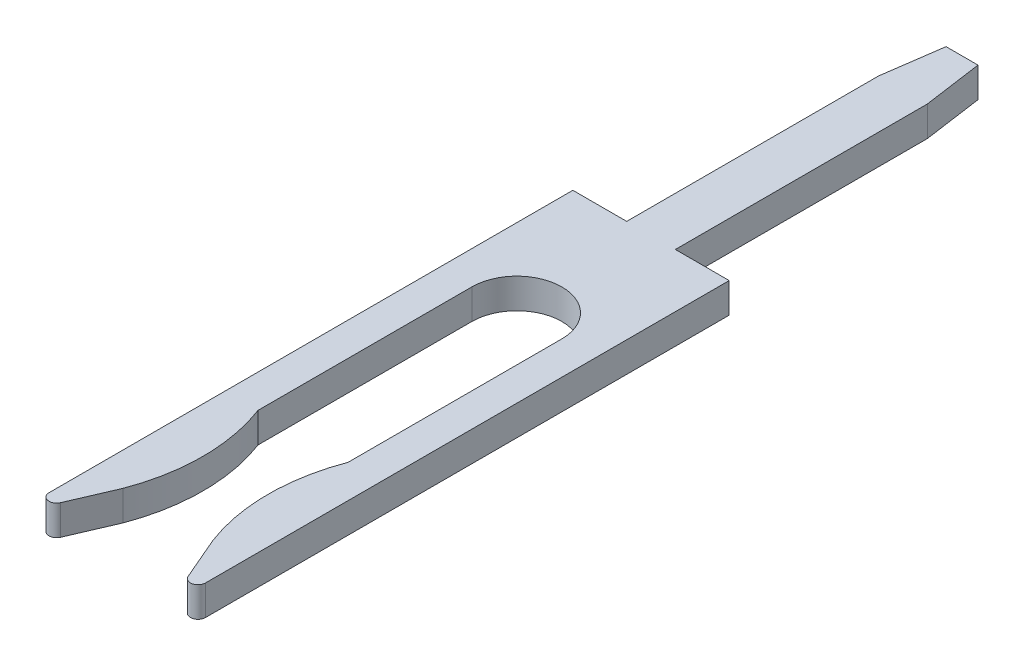
ISO-10303-21;
HEADER;
FILE_DESCRIPTION(('STEP AP214'),'2;1');
FILE_NAME('part.step','',(''),(''),'','','');
FILE_SCHEMA(('AUTOMOTIVE_DESIGN { 1 0 10303 214 1 1 1 1 }'));
ENDSEC;
DATA;
#1=APPLICATION_CONTEXT('core data for automotive mechanical design processes');
#2=APPLICATION_PROTOCOL_DEFINITION('international standard','automotive_design',2000,#1);
#3=PRODUCT_CONTEXT('',#1,'mechanical');
#4=PRODUCT('Part','Part','',(#3));
#5=PRODUCT_RELATED_PRODUCT_CATEGORY('part','',(#4));
#6=PRODUCT_DEFINITION_FORMATION('','',#4);
#7=PRODUCT_DEFINITION_CONTEXT('part definition',#1,'design');
#8=PRODUCT_DEFINITION('design','',#6,#7);
#9=PRODUCT_DEFINITION_SHAPE('','',#8);
#10=(LENGTH_UNIT() NAMED_UNIT(*) SI_UNIT(.MILLI.,.METRE.));
#11=(NAMED_UNIT(*) PLANE_ANGLE_UNIT() SI_UNIT($,.RADIAN.));
#12=(NAMED_UNIT(*) SI_UNIT($,.STERADIAN.) SOLID_ANGLE_UNIT());
#13=UNCERTAINTY_MEASURE_WITH_UNIT(LENGTH_MEASURE(1.E-05),#10,'distance_accuracy_value','');
#14=(GEOMETRIC_REPRESENTATION_CONTEXT(3) GLOBAL_UNCERTAINTY_ASSIGNED_CONTEXT((#13)) GLOBAL_UNIT_ASSIGNED_CONTEXT((#10,
#11,#12)) REPRESENTATION_CONTEXT('',''));
#15=CARTESIAN_POINT('',(0.,0.,0.));
#16=DIRECTION('',(0.,0.,1.));
#17=DIRECTION('',(1.,0.,0.));
#18=AXIS2_PLACEMENT_3D('',#15,#16,#17);
#19=CARTESIAN_POINT('',(9.381603649632,-23.37010019149,6.08077727531));
#20=DIRECTION('',(1.,0.,-4.371138828674E-08));
#21=DIRECTION('',(0.,-1.,0.));
#22=AXIS2_PLACEMENT_3D('',#19,#20,#21);
#23=PLANE('',#22);
#24=DIRECTION('',(0.,1.,4.37364078255666E-08));
#25=VECTOR('',#24,1.);
#26=CARTESIAN_POINT('',(9.381603802304,-23.37010034416,9.573270867218));
#27=LINE('',#26,#25);
#28=CARTESIAN_POINT('',(9.381603802294,-23.37010034415,9.573270867208));
#29=VERTEX_POINT('',#28);
#30=CARTESIAN_POINT('',(9.381603802294,-22.97010034415,9.573270884693));
#31=VERTEX_POINT('',#30);
#32=EDGE_CURVE('E40',#29,#31,#27,.T.);
#33=ORIENTED_EDGE('',*,*,#32,.F.);
#34=DIRECTION('',(-4.3712819479021E-08,4.3712844147161E-08,-1.));
#35=VECTOR('',#34,1.);
#36=CARTESIAN_POINT('',(9.381603802304,-23.37010034416,9.573270867218));
#37=LINE('',#36,#35);
#38=CARTESIAN_POINT('',(9.38160349697,-23.37010003883,2.588283683411));
#39=VERTEX_POINT('',#38);
#40=EDGE_CURVE('E11',#29,#39,#37,.T.);
#41=ORIENTED_EDGE('',*,*,#40,.T.);
#42=DIRECTION('',(0.,-1.,-4.37364144869066E-08));
#43=VECTOR('',#42,1.);
#44=CARTESIAN_POINT('',(9.38160349698,-22.97010003884,2.588283700906));
#45=LINE('',#44,#43);
#46=CARTESIAN_POINT('',(9.38160349697,-22.97010003883,2.588283700896));
#47=VERTEX_POINT('',#46);
#48=EDGE_CURVE('E234',#47,#39,#45,.T.);
#49=ORIENTED_EDGE('',*,*,#48,.F.);
#50=DIRECTION('',(-4.3712819479021E-08,4.37128446557811E-08,-1.));
#51=VECTOR('',#50,1.);
#52=CARTESIAN_POINT('',(9.381603802304,-22.97010034416,9.573270884703));
#53=LINE('',#52,#51);
#54=EDGE_CURVE('E281',#31,#47,#53,.T.);
#55=ORIENTED_EDGE('',*,*,#54,.F.);
#56=EDGE_LOOP('',(#33,#41,#49,#55));
#57=FACE_BOUND('',#56,.T.);
#58=ADVANCED_FACE('F17',(#57),#23,.T.);
#59=CARTESIAN_POINT('',(8.338800012427,-22.97010001243,1.984306335899));
#60=DIRECTION('',(0.,1.,4.371140912996E-08));
#61=DIRECTION('',(1.,0.,0.));
#62=AXIS2_PLACEMENT_3D('',#59,#60,#61);
#63=PLANE('',#62);
#64=DIRECTION('',(-1.,-1.39458328886679E-11,4.37253110603317E-08));
#65=VECTOR('',#64,1.);
#66=CARTESIAN_POINT('',(9.38160349698,-22.97010003884,2.588283700906));
#67=LINE('',#66,#65);
#68=CARTESIAN_POINT('',(8.663269665766,-22.97010003883,2.588283732295));
#69=VERTEX_POINT('',#68);
#70=EDGE_CURVE('E28',#47,#69,#67,.T.);
#71=ORIENTED_EDGE('',*,*,#70,.T.);
#72=DIRECTION('',(-4.37143635881707E-08,4.37143820937107E-08,-1.));
#73=VECTOR('',#72,1.);
#74=CARTESIAN_POINT('',(8.663269665776,-22.97010003884,2.588283732305));
#75=LINE('',#74,#73);
#76=CARTESIAN_POINT('',(8.66326951891,-22.97009989197,-0.7713859837047));
#77=VERTEX_POINT('',#76);
#78=EDGE_CURVE('E297',#69,#77,#75,.T.);
#79=ORIENTED_EDGE('',*,*,#78,.T.);
#80=DIRECTION('',(-0.140037263062269,4.32932606554139E-08,-0.990146234126064));
#81=VECTOR('',#80,1.);
#82=CARTESIAN_POINT('',(8.66326951892,-22.97009989198,-0.7713859837147));
#83=LINE('',#82,#81);
#84=CARTESIAN_POINT('',(8.551799857521,-22.97009985752,-1.55954238607));
#85=VERTEX_POINT('',#84);
#86=EDGE_CURVE('E317',#77,#85,#83,.T.);
#87=ORIENTED_EDGE('',*,*,#86,.T.);
#88=DIRECTION('',(-1.,2.34991975136183E-11,4.37348623640371E-08));
#89=VECTOR('',#88,1.);
#90=CARTESIAN_POINT('',(8.551799857531,-22.97009985753,-1.55954238608));
#91=LINE('',#90,#89);
#92=CARTESIAN_POINT('',(8.125799857521,-22.97009985752,-1.559542367449));
#93=VERTEX_POINT('',#92);
#94=EDGE_CURVE('E313',#85,#93,#91,.T.);
#95=ORIENTED_EDGE('',*,*,#94,.T.);
#96=DIRECTION('',(-0.140037176500974,-4.32932338761655E-08,0.990146246368501));
#97=VECTOR('',#96,1.);
#98=CARTESIAN_POINT('',(8.125799857531,-22.97009985753,-1.559542367459));
#99=LINE('',#98,#97);
#100=CARTESIAN_POINT('',(8.014330265035,-22.97009989197,-0.7713859553387));
#101=VERTEX_POINT('',#100);
#102=EDGE_CURVE('E192',#93,#101,#99,.T.);
#103=ORIENTED_EDGE('',*,*,#102,.T.);
#104=DIRECTION('',(4.37143651743608E-08,-4.37143863235508E-08,1.));
#105=VECTOR('',#104,1.);
#106=CARTESIAN_POINT('',(8.014330265045,-22.97009989198,-0.7713859553487));
#107=LINE('',#106,#105);
#108=CARTESIAN_POINT('',(8.01433041189,-22.97010003883,2.588283760661));
#109=VERTEX_POINT('',#108);
#110=EDGE_CURVE('E188',#101,#109,#107,.T.);
#111=ORIENTED_EDGE('',*,*,#110,.T.);
#112=DIRECTION('',(-1.,-1.39557244280175E-11,4.37253024052318E-08));
#113=VECTOR('',#112,1.);
#114=CARTESIAN_POINT('',(8.0143304119,-22.97010003884,2.588283760671));
#115=LINE('',#114,#113);
#116=CARTESIAN_POINT('',(7.295996580686,-22.97010003883,2.58828379206));
#117=VERTEX_POINT('',#116);
#118=EDGE_CURVE('E193',#109,#117,#115,.T.);
#119=ORIENTED_EDGE('',*,*,#118,.T.);
#120=DIRECTION('',(4.3712819606181E-08,-4.37128436385411E-08,1.));
#121=VECTOR('',#120,1.);
#122=CARTESIAN_POINT('',(7.295996580696,-22.97010003884,2.58828379207));
#123=LINE('',#122,#121);
#124=CARTESIAN_POINT('',(7.295996886009,-22.97010034415,9.573270975858));
#125=VERTEX_POINT('',#124);
#126=EDGE_CURVE('E323',#117,#125,#123,.T.);
#127=ORIENTED_EDGE('',*,*,#126,.T.);
#128=CARTESIAN_POINT('',(7.395996886019,-22.97010034416,9.573270971497));
#129=DIRECTION('',(0.,1.,4.38114091255787E-08));
#130=DIRECTION('',(-1.,0.,4.38113456497888E-08));
#131=AXIS2_PLACEMENT_3D('',#128,#129,#130);
#132=CIRCLE('',#131,0.10000000001);
#133=CARTESIAN_POINT('',(7.487841525873,-22.97010034588,9.612825517728));
#134=VERTEX_POINT('',#133);
#135=EDGE_CURVE('E215',#125,#134,#132,.T.);
#136=ORIENTED_EDGE('',*,*,#135,.T.);
#137=DIRECTION('',(0.395545462423989,4.01623851943643E-08,-0.918446398629659));
#138=VECTOR('',#137,1.);
#139=CARTESIAN_POINT('',(7.487841525883,-22.97010034589,9.612825517738));
#140=LINE('',#139,#138);
#141=CARTESIAN_POINT('',(7.738487148697,-22.97010032044,9.030832822857));
#142=VERTEX_POINT('',#141);
#143=EDGE_CURVE('E211',#134,#142,#140,.T.);
#144=ORIENTED_EDGE('',*,*,#143,.T.);
#145=CARTESIAN_POINT('',(5.356005364374,-22.97010028107,8.129959772465));
#146=DIRECTION('',(2.28394504348619E-12,1.,4.37164700476049E-08));
#147=DIRECTION('',(0.935365052917802,-1.5463942792553E-08,0.353683782184139));
#148=AXIS2_PLACEMENT_3D('',#145,#146,#147);
#149=CIRCLE('',#148,2.54711438802489);
#150=CARTESIAN_POINT('',(7.73848706994,-22.97010024168,7.229086513769));
#151=VERTEX_POINT('',#150);
#152=EDGE_CURVE('E216',#142,#151,#149,.T.);
#153=ORIENTED_EDGE('',*,*,#152,.T.);
#154=DIRECTION('',(-4.371489671998E-08,4.371491104835E-08,-1.));
#155=VECTOR('',#154,1.);
#156=CARTESIAN_POINT('',(7.73848706995,-22.97010024169,7.229086513779));
#157=LINE('',#156,#155);
#158=CARTESIAN_POINT('',(7.7384869453,-22.97010011704,4.377666394364));
#159=VERTEX_POINT('',#158);
#160=EDGE_CURVE('E178',#151,#159,#157,.T.);
#161=ORIENTED_EDGE('',*,*,#160,.T.);
#162=CARTESIAN_POINT('',(8.338800117055,-22.97010011705,4.377666368134));
#163=DIRECTION('',(0.,-1.,-4.37280671012212E-08));
#164=DIRECTION('',(-1.,0.,4.37279435239713E-08));
#165=AXIS2_PLACEMENT_3D('',#162,#163,#164);
#166=CIRCLE('',#165,0.6003131717543);
#167=CARTESIAN_POINT('',(8.939113288789,-22.97010011704,4.377666341883));
#168=VERTEX_POINT('',#167);
#169=EDGE_CURVE('E21',#159,#168,#166,.T.);
#170=ORIENTED_EDGE('',*,*,#169,.T.);
#171=DIRECTION('',(4.371489547403E-08,-4.37149135402399E-08,1.));
#172=VECTOR('',#171,1.);
#173=CARTESIAN_POINT('',(8.939113288799,-22.97010011705,4.377666341893));
#174=LINE('',#173,#172);
#175=CARTESIAN_POINT('',(8.939113413428,-22.97010024168,7.229086461288));
#176=VERTEX_POINT('',#175);
#177=EDGE_CURVE('E221',#168,#176,#174,.T.);
#178=ORIENTED_EDGE('',*,*,#177,.T.);
#179=CARTESIAN_POINT('',(11.32159519777,-22.97010028107,8.129959511701));
#180=DIRECTION('',(2.28394504348619E-12,1.,4.37164700476049E-08));
#181=DIRECTION('',(-0.935365052917802,1.5463942792553E-08,-0.353683782184139));
#182=AXIS2_PLACEMENT_3D('',#179,#180,#181);
#183=CIRCLE('',#182,2.54711438802489);
#184=CARTESIAN_POINT('',(8.939113492185,-22.97010032044,9.030832770376));
#185=VERTEX_POINT('',#184);
#186=EDGE_CURVE('E217',#176,#185,#183,.T.);
#187=ORIENTED_EDGE('',*,*,#186,.T.);
#188=DIRECTION('',(0.3955455427171,-4.01623739812454E-08,0.918446364049983));
#189=VECTOR('',#188,1.);
#190=CARTESIAN_POINT('',(8.939113492195,-22.97010032045,9.030832770386));
#191=LINE('',#190,#189);
#192=CARTESIAN_POINT('',(9.189759165889,-22.97010034588,9.612825443335));
#193=VERTEX_POINT('',#192);
#194=EDGE_CURVE('E222',#185,#193,#191,.T.);
#195=ORIENTED_EDGE('',*,*,#194,.T.);
#196=CARTESIAN_POINT('',(9.281603802304,-22.97010034416,9.573270889074));
#197=DIRECTION('',(-5.22868700025152E-11,1.,4.38428069325057E-08));
#198=DIRECTION('',(-0.91844636403244,-1.73898495497854E-08,0.395545542757836));
#199=AXIS2_PLACEMENT_3D('',#196,#197,#198);
#200=CIRCLE('',#199,0.10000000001314);
#201=EDGE_CURVE('E261',#193,#31,#200,.T.);
#202=ORIENTED_EDGE('',*,*,#201,.T.);
#203=ORIENTED_EDGE('',*,*,#54,.T.);
#204=EDGE_LOOP('',(#71,#79,#87,#95,#103,#111,#119,#127,#136,#144,#153,#161,#170,#178,#187,#195,
#202,#203));
#205=FACE_BOUND('',#204,.T.);
#206=ADVANCED_FACE('F366',(#205),#63,.T.);
#207=CARTESIAN_POINT('',(9.281603802294,-23.37010034415,9.57327087158));
#208=DIRECTION('',(0.,1.,4.37114091299599E-08));
#209=DIRECTION('',(-1.,0.,4.371138867532E-08));
#210=AXIS2_PLACEMENT_3D('',#207,#208,#209);
#211=CYLINDRICAL_SURFACE('',#210,0.1);
#212=DIRECTION('',(2.50133226756702E-11,-1.,-4.37363989437865E-08));
#213=VECTOR('',#212,1.);
#214=CARTESIAN_POINT('',(9.189759165899,-22.97010034589,9.612825443345));
#215=LINE('',#214,#213);
#216=CARTESIAN_POINT('',(9.189759165889,-23.37010034588,9.612825425851));
#217=VERTEX_POINT('',#216);
#218=EDGE_CURVE('E274',#193,#217,#215,.T.);
#219=ORIENTED_EDGE('',*,*,#218,.T.);
#220=CARTESIAN_POINT('',(9.281603802304,-23.37010034416,9.57327087159));
#221=DIRECTION('',(0.,-1.,-4.38114091255787E-08));
#222=DIRECTION('',(1.,0.,-4.38117719754288E-08));
#223=AXIS2_PLACEMENT_3D('',#220,#221,#222);
#224=CIRCLE('',#223,0.10000000001);
#225=EDGE_CURVE('E223',#29,#217,#224,.T.);
#226=ORIENTED_EDGE('',*,*,#225,.F.);
#227=ORIENTED_EDGE('',*,*,#32,.T.);
#228=ORIENTED_EDGE('',*,*,#201,.F.);
#229=EDGE_LOOP('',(#219,#226,#227,#228));
#230=FACE_BOUND('',#229,.T.);
#231=ADVANCED_FACE('F439',(#230),#211,.T.);
#232=CARTESIAN_POINT('',(8.338800012427,-23.37010001243,1.984306318415));
#233=DIRECTION('',(0.,1.,4.371140912996E-08));
#234=DIRECTION('',(1.,0.,0.));
#235=AXIS2_PLACEMENT_3D('',#232,#233,#234);
#236=PLANE('',#235);
#237=ORIENTED_EDGE('',*,*,#40,.F.);
#238=ORIENTED_EDGE('',*,*,#225,.T.);
#239=DIRECTION('',(-0.3955455427171,4.01623739812454E-08,-0.918446364049983));
#240=VECTOR('',#239,1.);
#241=CARTESIAN_POINT('',(9.189759165899,-23.37010034589,9.612825425861));
#242=LINE('',#241,#240);
#243=CARTESIAN_POINT('',(8.939113492185,-23.37010032044,9.030832752892));
#244=VERTEX_POINT('',#243);
#245=EDGE_CURVE('E226',#217,#244,#242,.T.);
#246=ORIENTED_EDGE('',*,*,#245,.T.);
#247=CARTESIAN_POINT('',(11.32159519777,-23.37010028107,8.129959494216));
#248=DIRECTION('',(2.28321054298537E-12,-1.,-4.37164697702397E-08));
#249=DIRECTION('',(-0.935365021997752,-1.54639455821522E-08,0.353683863956421));
#250=AXIS2_PLACEMENT_3D('',#247,#248,#249);
#251=CIRCLE('',#250,2.54711438802489);
#252=CARTESIAN_POINT('',(8.939113413428,-23.37010024168,7.229086443804));
#253=VERTEX_POINT('',#252);
#254=EDGE_CURVE('E241',#244,#253,#251,.T.);
#255=ORIENTED_EDGE('',*,*,#254,.T.);
#256=DIRECTION('',(4.371489547403E-08,-4.37149135402399E-08,1.));
#257=VECTOR('',#256,1.);
#258=CARTESIAN_POINT('',(8.939113288799,-23.37010011705,4.377666324409));
#259=LINE('',#258,#257);
#260=CARTESIAN_POINT('',(8.939113288789,-23.37010011704,4.377666324399));
#261=VERTEX_POINT('',#260);
#262=EDGE_CURVE('E210',#261,#253,#259,.T.);
#263=ORIENTED_EDGE('',*,*,#262,.F.);
#264=CARTESIAN_POINT('',(8.338800117055,-23.37010011705,4.377666350649));
#265=DIRECTION('',(0.,1.,4.37280671012212E-08));
#266=DIRECTION('',(1.,0.,-4.37280145411813E-08));
#267=AXIS2_PLACEMENT_3D('',#264,#265,#266);
#268=CIRCLE('',#267,0.6003131717543);
#269=CARTESIAN_POINT('',(7.7384869453,-23.37010011704,4.37766637688));
#270=VERTEX_POINT('',#269);
#271=EDGE_CURVE('E159',#261,#270,#268,.T.);
#272=ORIENTED_EDGE('',*,*,#271,.T.);
#273=DIRECTION('',(-4.371489703146E-08,4.37149122942899E-08,-1.));
#274=VECTOR('',#273,1.);
#275=CARTESIAN_POINT('',(7.73848706995,-23.37010024169,7.229086496295));
#276=LINE('',#275,#274);
#277=CARTESIAN_POINT('',(7.73848706994,-23.37010024168,7.229086496285));
#278=VERTEX_POINT('',#277);
#279=EDGE_CURVE('E153',#278,#270,#276,.T.);
#280=ORIENTED_EDGE('',*,*,#279,.F.);
#281=CARTESIAN_POINT('',(5.356005364374,-23.37010028107,8.12995975498));
#282=DIRECTION('',(2.28321054707473E-12,-1.,-4.37164697702413E-08));
#283=DIRECTION('',(0.935365021997785,1.54639455821528E-08,-0.353683863956333));
#284=AXIS2_PLACEMENT_3D('',#281,#282,#283);
#285=CIRCLE('',#284,2.54711438802489);
#286=CARTESIAN_POINT('',(7.738487148697,-23.37010032044,9.030832805373));
#287=VERTEX_POINT('',#286);
#288=EDGE_CURVE('E156',#278,#287,#285,.T.);
#289=ORIENTED_EDGE('',*,*,#288,.T.);
#290=DIRECTION('',(-0.395545462423989,-4.01623795878043E-08,0.918446398629659));
#291=VECTOR('',#290,1.);
#292=CARTESIAN_POINT('',(7.738487148707,-23.37010032045,9.030832805383));
#293=LINE('',#292,#291);
#294=CARTESIAN_POINT('',(7.487841525873,-23.37010034588,9.612825500244));
#295=VERTEX_POINT('',#294);
#296=EDGE_CURVE('E174',#287,#295,#293,.T.);
#297=ORIENTED_EDGE('',*,*,#296,.T.);
#298=CARTESIAN_POINT('',(7.395996886019,-23.37010034416,9.573270954012));
#299=DIRECTION('',(-5.22901050036894E-11,-1.,-4.38428083161989E-08));
#300=DIRECTION('',(0.918446398612329,-1.73898495497852E-08,0.395545462464231));
#301=AXIS2_PLACEMENT_3D('',#298,#299,#300);
#302=CIRCLE('',#301,0.10000000001314);
#303=CARTESIAN_POINT('',(7.295996886009,-23.37010034415,9.573270958373));
#304=VERTEX_POINT('',#303);
#305=EDGE_CURVE('E242',#295,#304,#302,.T.);
#306=ORIENTED_EDGE('',*,*,#305,.T.);
#307=DIRECTION('',(4.37128197333311E-08,-4.37128451644011E-08,1.));
#308=VECTOR('',#307,1.);
#309=CARTESIAN_POINT('',(7.295996580696,-23.37010003884,2.588283774586));
#310=LINE('',#309,#308);
#311=CARTESIAN_POINT('',(7.295996580686,-23.37010003883,2.588283774576));
#312=VERTEX_POINT('',#311);
#313=EDGE_CURVE('E205',#312,#304,#310,.T.);
#314=ORIENTED_EDGE('',*,*,#313,.F.);
#315=DIRECTION('',(-1.,-1.39606701976923E-11,4.37253024052318E-08));
#316=VECTOR('',#315,1.);
#317=CARTESIAN_POINT('',(8.0143304119,-23.37010003884,2.588283743186));
#318=LINE('',#317,#316);
#319=CARTESIAN_POINT('',(8.01433041189,-23.37010003883,2.588283743176));
#320=VERTEX_POINT('',#319);
#321=EDGE_CURVE('E204',#320,#312,#318,.T.);
#322=ORIENTED_EDGE('',*,*,#321,.F.);
#323=DIRECTION('',(4.37143657030908E-08,-4.37143852660907E-08,1.));
#324=VECTOR('',#323,1.);
#325=CARTESIAN_POINT('',(8.014330265045,-23.37009989198,-0.7713859728332));
#326=LINE('',#325,#324);
#327=CARTESIAN_POINT('',(8.014330265035,-23.37009989197,-0.7713859728232));
#328=VERTEX_POINT('',#327);
#329=EDGE_CURVE('E194',#328,#320,#326,.T.);
#330=ORIENTED_EDGE('',*,*,#329,.F.);
#331=DIRECTION('',(0.140037176500974,4.32932383393755E-08,-0.990146246368501));
#332=VECTOR('',#331,1.);
#333=CARTESIAN_POINT('',(8.014330265045,-23.37009989198,-0.7713859728332));
#334=LINE('',#333,#332);
#335=CARTESIAN_POINT('',(8.125799857521,-23.37009985752,-1.559542384934));
#336=VERTEX_POINT('',#335);
#337=EDGE_CURVE('E246',#328,#336,#334,.T.);
#338=ORIENTED_EDGE('',*,*,#337,.T.);
#339=DIRECTION('',(-1.,2.34908578101471E-11,4.37348613215771E-08));
#340=VECTOR('',#339,1.);
#341=CARTESIAN_POINT('',(8.551799857531,-23.37009985753,-1.559542403565));
#342=LINE('',#341,#340);
#343=CARTESIAN_POINT('',(8.551799857521,-23.37009985752,-1.559542403555));
#344=VERTEX_POINT('',#343);
#345=EDGE_CURVE('E265',#344,#336,#342,.T.);
#346=ORIENTED_EDGE('',*,*,#345,.F.);
#347=DIRECTION('',(0.140037263062269,-4.32932561922039E-08,0.990146234126064));
#348=VECTOR('',#347,1.);
#349=CARTESIAN_POINT('',(8.551799857531,-23.37009985753,-1.559542403565));
#350=LINE('',#349,#348);
#351=CARTESIAN_POINT('',(8.66326951891,-23.37009989197,-0.7713860011893));
#352=VERTEX_POINT('',#351);
#353=EDGE_CURVE('E237',#344,#352,#350,.T.);
#354=ORIENTED_EDGE('',*,*,#353,.T.);
#355=DIRECTION('',(-4.37143635881707E-08,4.37143842086307E-08,-1.));
#356=VECTOR('',#355,1.);
#357=CARTESIAN_POINT('',(8.663269665776,-23.37010003884,2.58828371482));
#358=LINE('',#357,#356);
#359=CARTESIAN_POINT('',(8.663269665766,-23.37010003883,2.58828371481));
#360=VERTEX_POINT('',#359);
#361=EDGE_CURVE('E256',#360,#352,#358,.T.);
#362=ORIENTED_EDGE('',*,*,#361,.F.);
#363=DIRECTION('',(-1.,-1.39458328886679E-11,4.37253110603317E-08));
#364=VECTOR('',#363,1.);
#365=CARTESIAN_POINT('',(9.38160349698,-23.37010003884,2.588283683421));
#366=LINE('',#365,#364);
#367=EDGE_CURVE('E238',#39,#360,#366,.T.);
#368=ORIENTED_EDGE('',*,*,#367,.F.);
#369=EDGE_LOOP('',(#237,#238,#246,#255,#263,#272,#280,#289,#297,#306,#314,#322,#330,#338,#346,
#354,#362,#368));
#370=FACE_BOUND('',#369,.T.);
#371=ADVANCED_FACE('F19',(#370),#236,.F.);
#372=CARTESIAN_POINT('',(9.022436581368,-23.37010003883,2.588283699111));
#373=DIRECTION('',(-4.37113882867399E-08,4.37114091299599E-08,-1.));
#374=DIRECTION('',(-1.,0.,4.371138828674E-08));
#375=AXIS2_PLACEMENT_3D('',#372,#373,#374);
#376=PLANE('',#375);
#377=ORIENTED_EDGE('',*,*,#48,.T.);
#378=ORIENTED_EDGE('',*,*,#367,.T.);
#379=DIRECTION('',(0.,-1.,-4.37364144869066E-08));
#380=VECTOR('',#379,1.);
#381=CARTESIAN_POINT('',(8.663269665776,-22.97010003884,2.588283732305));
#382=LINE('',#381,#380);
#383=EDGE_CURVE('E302',#69,#360,#382,.T.);
#384=ORIENTED_EDGE('',*,*,#383,.F.);
#385=ORIENTED_EDGE('',*,*,#70,.F.);
#386=EDGE_LOOP('',(#377,#378,#384,#385));
#387=FACE_BOUND('',#386,.T.);
#388=ADVANCED_FACE('F428',(#387),#376,.T.);
#389=CARTESIAN_POINT('',(8.663269434977,-23.37009980804,-2.691551143189));
#390=DIRECTION('',(1.,0.,-4.371138828674E-08));
#391=DIRECTION('',(0.,-1.,0.));
#392=AXIS2_PLACEMENT_3D('',#389,#390,#391);
#393=PLANE('',#392);
#394=ORIENTED_EDGE('',*,*,#383,.T.);
#395=ORIENTED_EDGE('',*,*,#361,.T.);
#396=DIRECTION('',(0.,-1.,-4.37364086582366E-08));
#397=VECTOR('',#396,1.);
#398=CARTESIAN_POINT('',(8.66326951892,-22.97009989198,-0.7713859837147));
#399=LINE('',#398,#397);
#400=EDGE_CURVE('E252',#77,#352,#399,.T.);
#401=ORIENTED_EDGE('',*,*,#400,.F.);
#402=ORIENTED_EDGE('',*,*,#78,.F.);
#403=EDGE_LOOP('',(#394,#395,#401,#402));
#404=FACE_BOUND('',#403,.T.);
#405=ADVANCED_FACE('F508',(#404),#393,.T.);
#406=CARTESIAN_POINT('',(8.607534688215,-23.37009987475,-1.165464202372));
#407=DIRECTION('',(0.990146234127561,6.12122420683376E-09,-0.140037263051694));
#408=DIRECTION('',(0.,-1.,-4.37113956202794E-08));
#409=AXIS2_PLACEMENT_3D('',#406,#407,#408);
#410=PLANE('',#409);
#411=ORIENTED_EDGE('',*,*,#400,.T.);
#412=ORIENTED_EDGE('',*,*,#353,.F.);
#413=DIRECTION('',(0.,-1.,-4.37364150420166E-08));
#414=VECTOR('',#413,1.);
#415=CARTESIAN_POINT('',(8.551799857531,-22.97009985753,-1.55954238608));
#416=LINE('',#415,#414);
#417=EDGE_CURVE('E257',#85,#344,#416,.T.);
#418=ORIENTED_EDGE('',*,*,#417,.F.);
#419=ORIENTED_EDGE('',*,*,#86,.F.);
#420=EDGE_LOOP('',(#411,#412,#418,#419));
#421=FACE_BOUND('',#420,.T.);
#422=ADVANCED_FACE('F506',(#421),#410,.T.);
#423=CARTESIAN_POINT('',(8.445299857521,-23.37009985752,-1.5595423989));
#424=DIRECTION('',(-4.37113882867399E-08,4.37114091299599E-08,-1.));
#425=DIRECTION('',(-1.,0.,4.371138828674E-08));
#426=AXIS2_PLACEMENT_3D('',#423,#424,#425);
#427=PLANE('',#426);
#428=ORIENTED_EDGE('',*,*,#417,.T.);
#429=ORIENTED_EDGE('',*,*,#345,.T.);
#430=DIRECTION('',(0.,-1.,-4.37364155971265E-08));
#431=VECTOR('',#430,1.);
#432=CARTESIAN_POINT('',(8.125799857531,-22.97009985753,-1.559542367459));
#433=LINE('',#432,#431);
#434=EDGE_CURVE('E306',#93,#336,#433,.T.);
#435=ORIENTED_EDGE('',*,*,#434,.F.);
#436=ORIENTED_EDGE('',*,*,#94,.F.);
#437=EDGE_LOOP('',(#428,#429,#435,#436));
#438=FACE_BOUND('',#437,.T.);
#439=ADVANCED_FACE('F465',(#438),#427,.T.);
#440=CARTESIAN_POINT('',(8.070065061278,-23.37009987475,-1.165464178879));
#441=DIRECTION('',(-0.990146246369998,6.12122420683399E-09,-0.1400371764904));
#442=DIRECTION('',(-0.1400371764904,0.,0.990146246369998));
#443=AXIS2_PLACEMENT_3D('',#440,#441,#442);
#444=PLANE('',#443);
#445=ORIENTED_EDGE('',*,*,#434,.T.);
#446=ORIENTED_EDGE('',*,*,#337,.F.);
#447=DIRECTION('',(0.,-1.,-4.37364092133466E-08));
#448=VECTOR('',#447,1.);
#449=CARTESIAN_POINT('',(8.014330265045,-22.97009989198,-0.7713859553487));
#450=LINE('',#449,#448);
#451=EDGE_CURVE('E198',#101,#328,#450,.T.);
#452=ORIENTED_EDGE('',*,*,#451,.F.);
#453=ORIENTED_EDGE('',*,*,#102,.F.);
#454=EDGE_LOOP('',(#445,#446,#452,#453));
#455=FACE_BOUND('',#454,.T.);
#456=ADVANCED_FACE('F350',(#455),#444,.T.);
#457=CARTESIAN_POINT('',(8.014330181101,-23.37009980804,-2.691551114823));
#458=DIRECTION('',(-1.,0.,4.371138828674E-08));
#459=DIRECTION('',(0.,1.,0.));
#460=AXIS2_PLACEMENT_3D('',#457,#458,#459);
#461=PLANE('',#460);
#462=ORIENTED_EDGE('',*,*,#451,.T.);
#463=ORIENTED_EDGE('',*,*,#329,.T.);
#464=DIRECTION('',(0.,-1.,-4.37364056051265E-08));
#465=VECTOR('',#464,1.);
#466=CARTESIAN_POINT('',(8.0143304119,-22.97010003884,2.588283760671));
#467=LINE('',#466,#465);
#468=EDGE_CURVE('E199',#109,#320,#467,.T.);
#469=ORIENTED_EDGE('',*,*,#468,.F.);
#470=ORIENTED_EDGE('',*,*,#110,.F.);
#471=EDGE_LOOP('',(#462,#463,#469,#470));
#472=FACE_BOUND('',#471,.T.);
#473=ADVANCED_FACE('F343',(#472),#461,.T.);
#474=CARTESIAN_POINT('',(7.655163496288,-23.37010003883,2.588283758876));
#475=DIRECTION('',(-4.37113882867399E-08,4.37114091299599E-08,-1.));
#476=DIRECTION('',(-1.,0.,4.371138828674E-08));
#477=AXIS2_PLACEMENT_3D('',#474,#475,#476);
#478=PLANE('',#477);
#479=ORIENTED_EDGE('',*,*,#468,.T.);
#480=ORIENTED_EDGE('',*,*,#321,.T.);
#481=DIRECTION('',(0.,-1.,-4.37364056051265E-08));
#482=VECTOR('',#481,1.);
#483=CARTESIAN_POINT('',(7.295996580696,-22.97010003884,2.58828379207));
#484=LINE('',#483,#482);
#485=EDGE_CURVE('E200',#117,#312,#484,.T.);
#486=ORIENTED_EDGE('',*,*,#485,.F.);
#487=ORIENTED_EDGE('',*,*,#118,.F.);
#488=EDGE_LOOP('',(#479,#480,#486,#487));
#489=FACE_BOUND('',#488,.T.);
#490=ADVANCED_FACE('F355',(#489),#478,.T.);
#491=CARTESIAN_POINT('',(7.295996733348,-23.37010019149,6.080777366474));
#492=DIRECTION('',(-1.,0.,4.371138828674E-08));
#493=DIRECTION('',(0.,1.,0.));
#494=AXIS2_PLACEMENT_3D('',#491,#492,#493);
#495=PLANE('',#494);
#496=ORIENTED_EDGE('',*,*,#485,.T.);
#497=ORIENTED_EDGE('',*,*,#313,.T.);
#498=DIRECTION('',(0.,-1.,-4.37364078255666E-08));
#499=VECTOR('',#498,1.);
#500=CARTESIAN_POINT('',(7.295996886019,-22.97010034416,9.573270975868));
#501=LINE('',#500,#499);
#502=EDGE_CURVE('E230',#125,#304,#501,.T.);
#503=ORIENTED_EDGE('',*,*,#502,.F.);
#504=ORIENTED_EDGE('',*,*,#126,.F.);
#505=EDGE_LOOP('',(#496,#497,#503,#504));
#506=FACE_BOUND('',#505,.T.);
#507=ADVANCED_FACE('F358',(#506),#495,.T.);
#508=CARTESIAN_POINT('',(7.395996886009,-23.37010034415,9.573270954002));
#509=DIRECTION('',(0.,1.,4.37114091299599E-08));
#510=DIRECTION('',(-1.,0.,4.371138867532E-08));
#511=AXIS2_PLACEMENT_3D('',#508,#509,#510);
#512=CYLINDRICAL_SURFACE('',#511,0.1);
#513=ORIENTED_EDGE('',*,*,#502,.T.);
#514=ORIENTED_EDGE('',*,*,#305,.F.);
#515=DIRECTION('',(0.,1.,4.37363989437865E-08));
#516=VECTOR('',#515,1.);
#517=CARTESIAN_POINT('',(7.487841525883,-23.37010034589,9.612825500254));
#518=LINE('',#517,#516);
#519=EDGE_CURVE('E184',#295,#134,#518,.T.);
#520=ORIENTED_EDGE('',*,*,#519,.T.);
#521=ORIENTED_EDGE('',*,*,#135,.F.);
#522=EDGE_LOOP('',(#513,#514,#520,#521));
#523=FACE_BOUND('',#522,.T.);
#524=ADVANCED_FACE('F378',(#523),#512,.T.);
#525=CARTESIAN_POINT('',(7.613164337285,-23.37010033316,9.321829152808));
#526=DIRECTION('',(0.918446398632924,-1.72898512920404E-08,0.395545462416411));
#527=DIRECTION('',(0.,-1.,-4.37114135665107E-08));
#528=AXIS2_PLACEMENT_3D('',#525,#526,#527);
#529=PLANE('',#528);
#530=ORIENTED_EDGE('',*,*,#519,.F.);
#531=ORIENTED_EDGE('',*,*,#296,.F.);
#532=DIRECTION('',(0.,-1.,-4.37363811802166E-08));
#533=VECTOR('',#532,1.);
#534=CARTESIAN_POINT('',(7.738487148707,-22.97010032045,9.030832822867));
#535=LINE('',#534,#533);
#536=EDGE_CURVE('E172',#142,#287,#535,.T.);
#537=ORIENTED_EDGE('',*,*,#536,.F.);
#538=ORIENTED_EDGE('',*,*,#143,.F.);
#539=EDGE_LOOP('',(#530,#531,#537,#538));
#540=FACE_BOUND('',#539,.T.);
#541=ADVANCED_FACE('F380',(#540),#529,.T.);
#542=CARTESIAN_POINT('',(5.356005364364,-23.37010028106,8.12995975497));
#543=DIRECTION('',(0.,1.,4.37114091299599E-08));
#544=DIRECTION('',(-1.,0.,4.37113882410099E-08));
#545=AXIS2_PLACEMENT_3D('',#542,#543,#544);
#546=CYLINDRICAL_SURFACE('',#545,2.547114388012);
#547=ORIENTED_EDGE('',*,*,#536,.T.);
#548=ORIENTED_EDGE('',*,*,#288,.F.);
#549=DIRECTION('',(0.,1.,4.37364100460165E-08));
#550=VECTOR('',#549,1.);
#551=CARTESIAN_POINT('',(7.73848706995,-23.37010024169,7.229086496295));
#552=LINE('',#551,#550);
#553=EDGE_CURVE('E165',#278,#151,#552,.T.);
#554=ORIENTED_EDGE('',*,*,#553,.T.);
#555=ORIENTED_EDGE('',*,*,#152,.F.);
#556=EDGE_LOOP('',(#547,#548,#554,#555));
#557=FACE_BOUND('',#556,.T.);
#558=ADVANCED_FACE('F170',(#557),#546,.T.);
#559=CARTESIAN_POINT('',(7.73848700762,-23.37010017936,5.803376436582));
#560=DIRECTION('',(1.,0.,-4.371138828674E-08));
#561=DIRECTION('',(0.,-1.,0.));
#562=AXIS2_PLACEMENT_3D('',#559,#560,#561);
#563=PLANE('',#562);
#564=ORIENTED_EDGE('',*,*,#553,.F.);
#565=ORIENTED_EDGE('',*,*,#279,.T.);
#566=DIRECTION('',(0.,-1.,-4.37364056051265E-08));
#567=VECTOR('',#566,1.);
#568=CARTESIAN_POINT('',(7.73848694531,-22.97010011705,4.377666394374));
#569=LINE('',#568,#567);
#570=EDGE_CURVE('E166',#159,#270,#569,.T.);
#571=ORIENTED_EDGE('',*,*,#570,.F.);
#572=ORIENTED_EDGE('',*,*,#160,.F.);
#573=EDGE_LOOP('',(#564,#565,#571,#572));
#574=FACE_BOUND('',#573,.T.);
#575=ADVANCED_FACE('F176',(#574),#563,.T.);
#576=CARTESIAN_POINT('',(8.338800117045,-23.37010011704,4.377666350639));
#577=DIRECTION('',(0.,1.,4.37114091299599E-08));
#578=DIRECTION('',(-1.,0.,4.371138789424E-08));
#579=AXIS2_PLACEMENT_3D('',#576,#577,#578);
#580=CYLINDRICAL_SURFACE('',#579,0.6003131717443);
#581=ORIENTED_EDGE('',*,*,#570,.T.);
#582=ORIENTED_EDGE('',*,*,#271,.F.);
#583=DIRECTION('',(0.,1.,4.37364122664665E-08));
#584=VECTOR('',#583,1.);
#585=CARTESIAN_POINT('',(8.939113288799,-23.37010011705,4.377666324409));
#586=LINE('',#585,#584);
#587=EDGE_CURVE('E206',#261,#168,#586,.T.);
#588=ORIENTED_EDGE('',*,*,#587,.T.);
#589=ORIENTED_EDGE('',*,*,#169,.F.);
#590=EDGE_LOOP('',(#581,#582,#588,#589));
#591=FACE_BOUND('',#590,.T.);
#592=ADVANCED_FACE('F460',(#591),#580,.F.);
#593=CARTESIAN_POINT('',(8.939113351109,-23.37010017936,5.803376384101));
#594=DIRECTION('',(-1.,0.,4.371138828674E-08));
#595=DIRECTION('',(0.,1.,0.));
#596=AXIS2_PLACEMENT_3D('',#593,#594,#595);
#597=PLANE('',#596);
#598=ORIENTED_EDGE('',*,*,#587,.F.);
#599=ORIENTED_EDGE('',*,*,#262,.T.);
#600=DIRECTION('',(0.,-1.,-4.37364056051265E-08));
#601=VECTOR('',#600,1.);
#602=CARTESIAN_POINT('',(8.939113413438,-22.97010024169,7.229086461298));
#603=LINE('',#602,#601);
#604=EDGE_CURVE('E247',#176,#253,#603,.T.);
#605=ORIENTED_EDGE('',*,*,#604,.F.);
#606=ORIENTED_EDGE('',*,*,#177,.F.);
#607=EDGE_LOOP('',(#598,#599,#605,#606));
#608=FACE_BOUND('',#607,.T.);
#609=ADVANCED_FACE('F457',(#608),#597,.T.);
#610=CARTESIAN_POINT('',(11.32159519776,-23.37010028106,8.129959494206));
#611=DIRECTION('',(0.,1.,4.37114091299599E-08));
#612=DIRECTION('',(-1.,0.,4.37113882410099E-08));
#613=AXIS2_PLACEMENT_3D('',#610,#611,#612);
#614=CYLINDRICAL_SURFACE('',#613,2.547114388012);
#615=ORIENTED_EDGE('',*,*,#186,.F.);
#616=ORIENTED_EDGE('',*,*,#604,.T.);
#617=ORIENTED_EDGE('',*,*,#254,.F.);
#618=DIRECTION('',(0.,1.,4.37364389118065E-08));
#619=VECTOR('',#618,1.);
#620=CARTESIAN_POINT('',(8.939113492195,-23.37010032045,9.030832752902));
#621=LINE('',#620,#619);
#622=EDGE_CURVE('E251',#244,#185,#621,.T.);
#623=ORIENTED_EDGE('',*,*,#622,.T.);
#624=EDGE_LOOP('',(#615,#616,#617,#623));
#625=FACE_BOUND('',#624,.T.);
#626=ADVANCED_FACE('F409',(#625),#614,.T.);
#627=CARTESIAN_POINT('',(9.064436329037,-23.37010033316,9.321829089371));
#628=DIRECTION('',(-0.918446364053248,-1.72898512920409E-08,0.395545542709521));
#629=DIRECTION('',(-1.88251072340665E-08,1.,0.));
#630=AXIS2_PLACEMENT_3D('',#627,#628,#629);
#631=PLANE('',#630);
#632=ORIENTED_EDGE('',*,*,#622,.F.);
#633=ORIENTED_EDGE('',*,*,#245,.F.);
#634=ORIENTED_EDGE('',*,*,#218,.F.);
#635=ORIENTED_EDGE('',*,*,#194,.F.);
#636=EDGE_LOOP('',(#632,#633,#634,#635));
#637=FACE_BOUND('',#636,.T.);
#638=ADVANCED_FACE('F415',(#637),#631,.T.);
#639=CLOSED_SHELL('',(#58,#206,#231,#371,#388,#405,#422,#439,#456,#473,#490,#507,#524,#541,#558,
#575,#592,#609,#626,#638));
#640=MANIFOLD_SOLID_BREP('B1',#639);
#641=ADVANCED_BREP_SHAPE_REPRESENTATION('',(#18,#640),#14);
#642=SHAPE_DEFINITION_REPRESENTATION(#9,#641);
ENDSEC;
END-ISO-10303-21;
